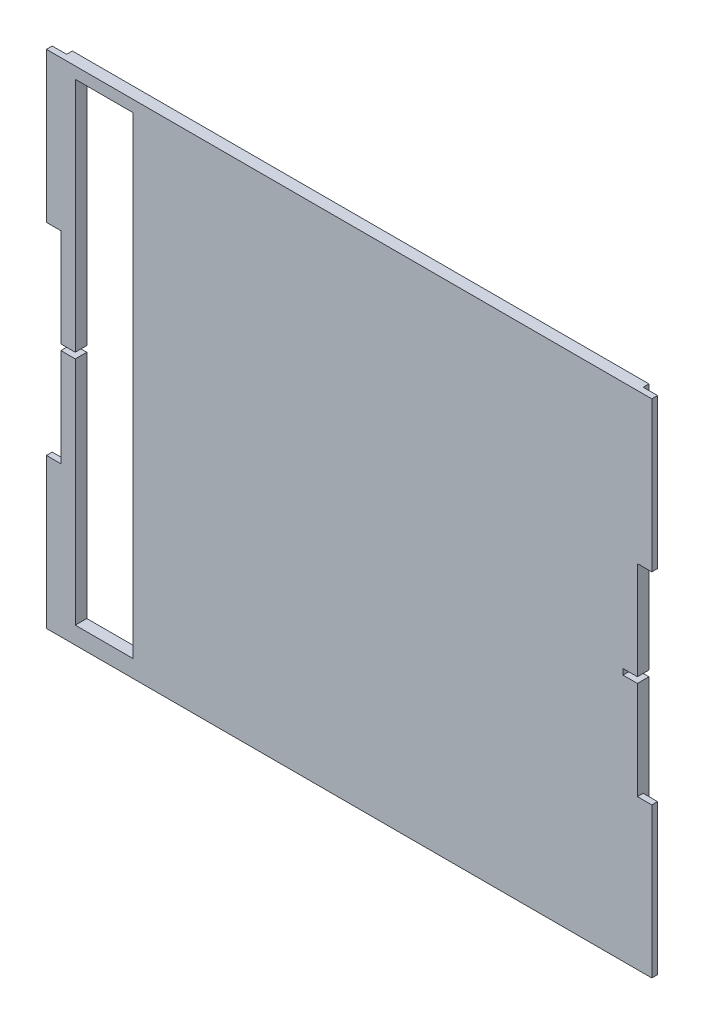
ISO-10303-21;
HEADER;
FILE_DESCRIPTION(('STEP AP214'),'2;1');
FILE_NAME('part.step','',(''),(''),'','','');
FILE_SCHEMA(('AUTOMOTIVE_DESIGN { 1 0 10303 214 1 1 1 1 }'));
ENDSEC;
DATA;
#1=APPLICATION_CONTEXT('core data for automotive mechanical design processes');
#2=APPLICATION_PROTOCOL_DEFINITION('international standard','automotive_design',2000,#1);
#3=PRODUCT_CONTEXT('',#1,'mechanical');
#4=PRODUCT('Part','Part','',(#3));
#5=PRODUCT_RELATED_PRODUCT_CATEGORY('part','',(#4));
#6=PRODUCT_DEFINITION_FORMATION('','',#4);
#7=PRODUCT_DEFINITION_CONTEXT('part definition',#1,'design');
#8=PRODUCT_DEFINITION('design','',#6,#7);
#9=PRODUCT_DEFINITION_SHAPE('','',#8);
#10=(LENGTH_UNIT() NAMED_UNIT(*) SI_UNIT(.MILLI.,.METRE.));
#11=(NAMED_UNIT(*) PLANE_ANGLE_UNIT() SI_UNIT($,.RADIAN.));
#12=(NAMED_UNIT(*) SI_UNIT($,.STERADIAN.) SOLID_ANGLE_UNIT());
#13=UNCERTAINTY_MEASURE_WITH_UNIT(LENGTH_MEASURE(1.E-05),#10,'distance_accuracy_value','');
#14=(GEOMETRIC_REPRESENTATION_CONTEXT(3) GLOBAL_UNCERTAINTY_ASSIGNED_CONTEXT((#13)) GLOBAL_UNIT_ASSIGNED_CONTEXT((#10,
#11,#12)) REPRESENTATION_CONTEXT('',''));
#15=CARTESIAN_POINT('',(0.,0.,0.));
#16=DIRECTION('',(0.,0.,1.));
#17=DIRECTION('',(1.,0.,0.));
#18=AXIS2_PLACEMENT_3D('',#15,#16,#17);
#19=CARTESIAN_POINT('',(0.,0.,2.));
#20=DIRECTION('',(0.,0.,1.));
#21=DIRECTION('',(1.,0.,0.));
#22=AXIS2_PLACEMENT_3D('',#19,#20,#21);
#23=PLANE('',#22);
#24=DIRECTION('',(0.,-1.,0.));
#25=VECTOR('',#24,1.);
#26=CARTESIAN_POINT('',(-100.5,35.,2.));
#27=LINE('',#26,#25);
#28=CARTESIAN_POINT('',(-100.5,35.,2.));
#29=VERTEX_POINT('',#28);
#30=CARTESIAN_POINT('',(-100.5,1.,2.));
#31=VERTEX_POINT('',#30);
#32=EDGE_CURVE('E235',#29,#31,#27,.T.);
#33=ORIENTED_EDGE('',*,*,#32,.T.);
#34=DIRECTION('',(1.,0.,0.));
#35=VECTOR('',#34,1.);
#36=CARTESIAN_POINT('',(-100.5,1.,2.));
#37=LINE('',#36,#35);
#38=CARTESIAN_POINT('',(-95.5,1.00000000000004,2.));
#39=VERTEX_POINT('',#38);
#40=EDGE_CURVE('E219',#31,#39,#37,.T.);
#41=ORIENTED_EDGE('',*,*,#40,.T.);
#42=DIRECTION('',(0.,-1.,0.));
#43=VECTOR('',#42,1.);
#44=CARTESIAN_POINT('',(-95.5,-81.,2.));
#45=LINE('',#44,#43);
#46=CARTESIAN_POINT('',(-95.5,83.,2.));
#47=VERTEX_POINT('',#46);
#48=EDGE_CURVE('E444',#47,#39,#45,.T.);
#49=ORIENTED_EDGE('',*,*,#48,.F.);
#50=DIRECTION('',(-1.,0.,0.));
#51=VECTOR('',#50,1.);
#52=CARTESIAN_POINT('',(-95.5,83.,2.));
#53=LINE('',#52,#51);
#54=CARTESIAN_POINT('',(-75.5,83.,2.));
#55=VERTEX_POINT('',#54);
#56=EDGE_CURVE('E450',#55,#47,#53,.T.);
#57=ORIENTED_EDGE('',*,*,#56,.F.);
#58=DIRECTION('',(0.,1.,0.));
#59=VECTOR('',#58,1.);
#60=CARTESIAN_POINT('',(-75.5,83.,2.));
#61=LINE('',#60,#59);
#62=CARTESIAN_POINT('',(-75.5,-81.,2.));
#63=VERTEX_POINT('',#62);
#64=EDGE_CURVE('E448',#63,#55,#61,.T.);
#65=ORIENTED_EDGE('',*,*,#64,.F.);
#66=DIRECTION('',(1.,0.,0.));
#67=VECTOR('',#66,1.);
#68=CARTESIAN_POINT('',(-75.5,-81.,2.));
#69=LINE('',#68,#67);
#70=CARTESIAN_POINT('',(-95.5,-81.,2.));
#71=VERTEX_POINT('',#70);
#72=EDGE_CURVE('E446',#71,#63,#69,.T.);
#73=ORIENTED_EDGE('',*,*,#72,.F.);
#74=CARTESIAN_POINT('',(-95.5,-0.999999999999957,2.));
#75=VERTEX_POINT('',#74);
#76=EDGE_CURVE('E393',#75,#71,#45,.T.);
#77=ORIENTED_EDGE('',*,*,#76,.F.);
#78=DIRECTION('',(-1.,0.,0.));
#79=VECTOR('',#78,1.);
#80=CARTESIAN_POINT('',(-95.5,-0.999999999999957,2.));
#81=LINE('',#80,#79);
#82=CARTESIAN_POINT('',(-100.5,-0.999999999999958,2.));
#83=VERTEX_POINT('',#82);
#84=EDGE_CURVE('E227',#75,#83,#81,.T.);
#85=ORIENTED_EDGE('',*,*,#84,.T.);
#86=CARTESIAN_POINT('',(-100.5,-35.,2.));
#87=VERTEX_POINT('',#86);
#88=EDGE_CURVE('E244',#83,#87,#27,.T.);
#89=ORIENTED_EDGE('',*,*,#88,.T.);
#90=DIRECTION('',(-1.,0.,0.));
#91=VECTOR('',#90,1.);
#92=CARTESIAN_POINT('',(-100.5,-35.,2.));
#93=LINE('',#92,#91);
#94=CARTESIAN_POINT('',(-105.5,-35.,2.));
#95=VERTEX_POINT('',#94);
#96=EDGE_CURVE('E279',#87,#95,#93,.T.);
#97=ORIENTED_EDGE('',*,*,#96,.T.);
#98=DIRECTION('',(0.,-1.,0.));
#99=VECTOR('',#98,1.);
#100=CARTESIAN_POINT('',(-105.5,-35.,2.));
#101=LINE('',#100,#99);
#102=CARTESIAN_POINT('',(-105.5,-87.,2.));
#103=VERTEX_POINT('',#102);
#104=EDGE_CURVE('E401',#95,#103,#101,.T.);
#105=ORIENTED_EDGE('',*,*,#104,.T.);
#106=DIRECTION('',(1.,0.,0.));
#107=VECTOR('',#106,1.);
#108=CARTESIAN_POINT('',(104.5,-87.,2.));
#109=LINE('',#108,#107);
#110=CARTESIAN_POINT('',(104.5,-87.,2.));
#111=VERTEX_POINT('',#110);
#112=EDGE_CURVE('E403',#103,#111,#109,.T.);
#113=ORIENTED_EDGE('',*,*,#112,.T.);
#114=DIRECTION('',(0.,1.,0.));
#115=VECTOR('',#114,1.);
#116=CARTESIAN_POINT('',(104.5,-35.,2.));
#117=LINE('',#116,#115);
#118=CARTESIAN_POINT('',(104.5,-35.,2.));
#119=VERTEX_POINT('',#118);
#120=EDGE_CURVE('E409',#111,#119,#117,.T.);
#121=ORIENTED_EDGE('',*,*,#120,.T.);
#122=DIRECTION('',(-1.,0.,0.));
#123=VECTOR('',#122,1.);
#124=CARTESIAN_POINT('',(99.5,-35.,2.));
#125=LINE('',#124,#123);
#126=CARTESIAN_POINT('',(99.5,-35.,2.));
#127=VERTEX_POINT('',#126);
#128=EDGE_CURVE('E411',#119,#127,#125,.T.);
#129=ORIENTED_EDGE('',*,*,#128,.T.);
#130=DIRECTION('',(0.,1.,0.));
#131=VECTOR('',#130,1.);
#132=CARTESIAN_POINT('',(99.5,35.,2.));
#133=LINE('',#132,#131);
#134=CARTESIAN_POINT('',(99.5,-1.,2.));
#135=VERTEX_POINT('',#134);
#136=EDGE_CURVE('E414',#127,#135,#133,.T.);
#137=ORIENTED_EDGE('',*,*,#136,.T.);
#138=DIRECTION('',(1.,0.,0.));
#139=VECTOR('',#138,1.);
#140=CARTESIAN_POINT('',(94.5,-1.,2.));
#141=LINE('',#140,#139);
#142=CARTESIAN_POINT('',(94.5,-1.,2.));
#143=VERTEX_POINT('',#142);
#144=EDGE_CURVE('E359',#143,#135,#141,.T.);
#145=ORIENTED_EDGE('',*,*,#144,.F.);
#146=DIRECTION('',(0.,-1.,0.));
#147=VECTOR('',#146,1.);
#148=CARTESIAN_POINT('',(94.5,0.999999999999999,2.));
#149=LINE('',#148,#147);
#150=CARTESIAN_POINT('',(94.5,0.999999999999999,2.));
#151=VERTEX_POINT('',#150);
#152=EDGE_CURVE('E356',#151,#143,#149,.T.);
#153=ORIENTED_EDGE('',*,*,#152,.F.);
#154=DIRECTION('',(-1.,0.,0.));
#155=VECTOR('',#154,1.);
#156=CARTESIAN_POINT('',(99.5,1.,2.));
#157=LINE('',#156,#155);
#158=CARTESIAN_POINT('',(99.5,1.,2.));
#159=VERTEX_POINT('',#158);
#160=EDGE_CURVE('E228',#159,#151,#157,.T.);
#161=ORIENTED_EDGE('',*,*,#160,.F.);
#162=CARTESIAN_POINT('',(99.5,35.,2.));
#163=VERTEX_POINT('',#162);
#164=EDGE_CURVE('E413',#159,#163,#133,.T.);
#165=ORIENTED_EDGE('',*,*,#164,.T.);
#166=DIRECTION('',(1.,0.,0.));
#167=VECTOR('',#166,1.);
#168=CARTESIAN_POINT('',(104.5,35.,2.));
#169=LINE('',#168,#167);
#170=CARTESIAN_POINT('',(104.5,35.,2.));
#171=VERTEX_POINT('',#170);
#172=EDGE_CURVE('E417',#163,#171,#169,.T.);
#173=ORIENTED_EDGE('',*,*,#172,.T.);
#174=DIRECTION('',(0.,1.,0.));
#175=VECTOR('',#174,1.);
#176=CARTESIAN_POINT('',(104.5,35.,2.));
#177=LINE('',#176,#175);
#178=CARTESIAN_POINT('',(104.5,87.0000000000001,2.));
#179=VERTEX_POINT('',#178);
#180=EDGE_CURVE('E419',#171,#179,#177,.T.);
#181=ORIENTED_EDGE('',*,*,#180,.T.);
#182=DIRECTION('',(-1.,0.,0.));
#183=VECTOR('',#182,1.);
#184=CARTESIAN_POINT('',(104.5,87.0000000000001,2.));
#185=LINE('',#184,#183);
#186=CARTESIAN_POINT('',(-105.5,87.,2.));
#187=VERTEX_POINT('',#186);
#188=EDGE_CURVE('E421',#179,#187,#185,.T.);
#189=ORIENTED_EDGE('',*,*,#188,.T.);
#190=DIRECTION('',(0.,-1.,0.));
#191=VECTOR('',#190,1.);
#192=CARTESIAN_POINT('',(-105.5,35.,2.));
#193=LINE('',#192,#191);
#194=CARTESIAN_POINT('',(-105.5,35.,2.));
#195=VERTEX_POINT('',#194);
#196=EDGE_CURVE('E422',#187,#195,#193,.T.);
#197=ORIENTED_EDGE('',*,*,#196,.T.);
#198=DIRECTION('',(1.,0.,0.));
#199=VECTOR('',#198,1.);
#200=CARTESIAN_POINT('',(-105.5,35.,2.));
#201=LINE('',#200,#199);
#202=EDGE_CURVE('E241',#195,#29,#201,.T.);
#203=ORIENTED_EDGE('',*,*,#202,.T.);
#204=EDGE_LOOP('',(#33,#41,#49,#57,#65,#73,#77,#85,#89,#97,#105,#113,#121,#129,#137,#145,#153,
#161,#165,#173,#181,#189,#197,#203));
#205=FACE_BOUND('',#204,.T.);
#206=ADVANCED_FACE('F33',(#205),#23,.T.);
#207=CARTESIAN_POINT('',(99.5,35.,2.));
#208=DIRECTION('',(-1.,0.,0.));
#209=DIRECTION('',(0.,0.,1.));
#210=AXIS2_PLACEMENT_3D('',#207,#208,#209);
#211=PLANE('',#210);
#212=DIRECTION('',(0.,1.,0.));
#213=VECTOR('',#212,1.);
#214=CARTESIAN_POINT('',(99.5,87.0000000000001,-2.));
#215=LINE('',#214,#213);
#216=CARTESIAN_POINT('',(99.5,-87.0000000000001,-2.));
#217=VERTEX_POINT('',#216);
#218=CARTESIAN_POINT('',(99.5,-1.,-2.));
#219=VERTEX_POINT('',#218);
#220=EDGE_CURVE('E343',#217,#219,#215,.T.);
#221=ORIENTED_EDGE('',*,*,#220,.T.);
#222=DIRECTION('',(0.,0.,1.));
#223=VECTOR('',#222,1.);
#224=CARTESIAN_POINT('',(99.5,-1.,-2.));
#225=LINE('',#224,#223);
#226=EDGE_CURVE('E369',#219,#135,#225,.T.);
#227=ORIENTED_EDGE('',*,*,#226,.T.);
#228=ORIENTED_EDGE('',*,*,#136,.F.);
#229=DIRECTION('',(0.,0.,-1.));
#230=VECTOR('',#229,1.);
#231=CARTESIAN_POINT('',(99.5,-35.,2.));
#232=LINE('',#231,#230);
#233=CARTESIAN_POINT('',(99.5,-35.,0.));
#234=VERTEX_POINT('',#233);
#235=EDGE_CURVE('E297',#127,#234,#232,.T.);
#236=ORIENTED_EDGE('',*,*,#235,.T.);
#237=DIRECTION('',(0.,1.,0.));
#238=VECTOR('',#237,1.);
#239=CARTESIAN_POINT('',(99.5,87.0000000000001,0.));
#240=LINE('',#239,#238);
#241=CARTESIAN_POINT('',(99.5,-87.0000000000001,0.));
#242=VERTEX_POINT('',#241);
#243=EDGE_CURVE('E44',#242,#234,#240,.T.);
#244=ORIENTED_EDGE('',*,*,#243,.F.);
#245=DIRECTION('',(0.,0.,1.));
#246=VECTOR('',#245,1.);
#247=CARTESIAN_POINT('',(99.5,-87.0000000000001,-2.));
#248=LINE('',#247,#246);
#249=EDGE_CURVE('E338',#217,#242,#248,.T.);
#250=ORIENTED_EDGE('',*,*,#249,.F.);
#251=EDGE_LOOP('',(#221,#227,#228,#236,#244,#250));
#252=FACE_BOUND('',#251,.T.);
#253=ADVANCED_FACE('F484',(#252),#211,.F.);
#254=CARTESIAN_POINT('',(-100.5,35.,2.));
#255=DIRECTION('',(1.,0.,0.));
#256=DIRECTION('',(0.,0.,-1.));
#257=AXIS2_PLACEMENT_3D('',#254,#255,#256);
#258=PLANE('',#257);
#259=DIRECTION('',(0.,0.,1.));
#260=VECTOR('',#259,1.);
#261=CARTESIAN_POINT('',(-100.5,1.,-2.));
#262=LINE('',#261,#260);
#263=CARTESIAN_POINT('',(-100.5,1.00000000000001,-2.));
#264=VERTEX_POINT('',#263);
#265=EDGE_CURVE('E59',#264,#31,#262,.T.);
#266=ORIENTED_EDGE('',*,*,#265,.T.);
#267=ORIENTED_EDGE('',*,*,#32,.F.);
#268=DIRECTION('',(0.,0.,-1.));
#269=VECTOR('',#268,1.);
#270=CARTESIAN_POINT('',(-100.5,35.,2.));
#271=LINE('',#270,#269);
#272=CARTESIAN_POINT('',(-100.5,35.,0.));
#273=VERTEX_POINT('',#272);
#274=EDGE_CURVE('E247',#29,#273,#271,.T.);
#275=ORIENTED_EDGE('',*,*,#274,.T.);
#276=DIRECTION('',(0.,-1.,0.));
#277=VECTOR('',#276,1.);
#278=CARTESIAN_POINT('',(-100.5,87.0000000000001,0.));
#279=LINE('',#278,#277);
#280=CARTESIAN_POINT('',(-100.5,87.0000000000001,0.));
#281=VERTEX_POINT('',#280);
#282=EDGE_CURVE('E316',#281,#273,#279,.T.);
#283=ORIENTED_EDGE('',*,*,#282,.F.);
#284=DIRECTION('',(0.,0.,1.));
#285=VECTOR('',#284,1.);
#286=CARTESIAN_POINT('',(-100.5,87.0000000000001,-2.));
#287=LINE('',#286,#285);
#288=CARTESIAN_POINT('',(-100.5,87.0000000000001,-2.));
#289=VERTEX_POINT('',#288);
#290=EDGE_CURVE('E432',#289,#281,#287,.T.);
#291=ORIENTED_EDGE('',*,*,#290,.F.);
#292=DIRECTION('',(0.,-1.,0.));
#293=VECTOR('',#292,1.);
#294=CARTESIAN_POINT('',(-100.5,87.0000000000001,-2.));
#295=LINE('',#294,#293);
#296=EDGE_CURVE('E237',#289,#264,#295,.T.);
#297=ORIENTED_EDGE('',*,*,#296,.T.);
#298=EDGE_LOOP('',(#266,#267,#275,#283,#291,#297));
#299=FACE_BOUND('',#298,.T.);
#300=ADVANCED_FACE('F233',(#299),#258,.F.);
#301=DIRECTION('',(0.,0.,1.));
#302=VECTOR('',#301,1.);
#303=CARTESIAN_POINT('',(-100.5,-0.999999999999958,-2.));
#304=LINE('',#303,#302);
#305=CARTESIAN_POINT('',(-100.5,-0.999999999999958,-2.));
#306=VERTEX_POINT('',#305);
#307=EDGE_CURVE('E381',#306,#83,#304,.T.);
#308=ORIENTED_EDGE('',*,*,#307,.F.);
#309=CARTESIAN_POINT('',(-100.5,-87.0000000000001,-2.));
#310=VERTEX_POINT('',#309);
#311=EDGE_CURVE('E339',#306,#310,#295,.T.);
#312=ORIENTED_EDGE('',*,*,#311,.T.);
#313=DIRECTION('',(0.,0.,1.));
#314=VECTOR('',#313,1.);
#315=CARTESIAN_POINT('',(-100.5,-87.0000000000001,-2.));
#316=LINE('',#315,#314);
#317=CARTESIAN_POINT('',(-100.5,-87.,0.));
#318=VERTEX_POINT('',#317);
#319=EDGE_CURVE('E438',#310,#318,#316,.T.);
#320=ORIENTED_EDGE('',*,*,#319,.T.);
#321=CARTESIAN_POINT('',(-100.5,-35.,0.));
#322=VERTEX_POINT('',#321);
#323=EDGE_CURVE('E42',#322,#318,#279,.T.);
#324=ORIENTED_EDGE('',*,*,#323,.F.);
#325=DIRECTION('',(0.,0.,-1.));
#326=VECTOR('',#325,1.);
#327=CARTESIAN_POINT('',(-100.5,-35.,2.));
#328=LINE('',#327,#326);
#329=EDGE_CURVE('E243',#87,#322,#328,.T.);
#330=ORIENTED_EDGE('',*,*,#329,.F.);
#331=ORIENTED_EDGE('',*,*,#88,.F.);
#332=EDGE_LOOP('',(#308,#312,#320,#324,#330,#331));
#333=FACE_BOUND('',#332,.T.);
#334=ADVANCED_FACE('F397',(#333),#258,.F.);
#335=CARTESIAN_POINT('',(-95.5,35.,2.));
#336=DIRECTION('',(1.,0.,0.));
#337=DIRECTION('',(0.,0.,-1.));
#338=AXIS2_PLACEMENT_3D('',#335,#336,#337);
#339=PLANE('',#338);
#340=ORIENTED_EDGE('',*,*,#48,.T.);
#341=DIRECTION('',(0.,0.,1.));
#342=VECTOR('',#341,1.);
#343=CARTESIAN_POINT('',(-95.5,1.00000000000004,-2.));
#344=LINE('',#343,#342);
#345=CARTESIAN_POINT('',(-95.5,1.00000000000004,-2.));
#346=VERTEX_POINT('',#345);
#347=EDGE_CURVE('E222',#346,#39,#344,.T.);
#348=ORIENTED_EDGE('',*,*,#347,.F.);
#349=DIRECTION('',(0.,-1.,0.));
#350=VECTOR('',#349,1.);
#351=CARTESIAN_POINT('',(-95.5,83.,-2.));
#352=LINE('',#351,#350);
#353=CARTESIAN_POINT('',(-95.5,83.,-2.));
#354=VERTEX_POINT('',#353);
#355=EDGE_CURVE('E351',#354,#346,#352,.T.);
#356=ORIENTED_EDGE('',*,*,#355,.F.);
#357=DIRECTION('',(0.,0.,-1.));
#358=VECTOR('',#357,1.);
#359=CARTESIAN_POINT('',(-95.5,83.,2.));
#360=LINE('',#359,#358);
#361=EDGE_CURVE('E453',#47,#354,#360,.T.);
#362=ORIENTED_EDGE('',*,*,#361,.F.);
#363=EDGE_LOOP('',(#340,#348,#356,#362));
#364=FACE_BOUND('',#363,.T.);
#365=ADVANCED_FACE('F572',(#364),#339,.T.);
#366=CARTESIAN_POINT('',(-95.5,-0.999999999999959,-2.));
#367=VERTEX_POINT('',#366);
#368=CARTESIAN_POINT('',(-95.5,-81.,-2.));
#369=VERTEX_POINT('',#368);
#370=EDGE_CURVE('E238',#367,#369,#352,.T.);
#371=ORIENTED_EDGE('',*,*,#370,.F.);
#372=DIRECTION('',(0.,0.,1.));
#373=VECTOR('',#372,1.);
#374=CARTESIAN_POINT('',(-95.5,-0.999999999999957,-2.));
#375=LINE('',#374,#373);
#376=EDGE_CURVE('E378',#367,#75,#375,.T.);
#377=ORIENTED_EDGE('',*,*,#376,.T.);
#378=ORIENTED_EDGE('',*,*,#76,.T.);
#379=DIRECTION('',(0.,0.,-1.));
#380=VECTOR('',#379,1.);
#381=CARTESIAN_POINT('',(-95.5,-81.,2.));
#382=LINE('',#381,#380);
#383=EDGE_CURVE('E256',#71,#369,#382,.T.);
#384=ORIENTED_EDGE('',*,*,#383,.T.);
#385=EDGE_LOOP('',(#371,#377,#378,#384));
#386=FACE_BOUND('',#385,.T.);
#387=ADVANCED_FACE('F465',(#386),#339,.T.);
#388=CARTESIAN_POINT('',(0.,0.,-2.));
#389=DIRECTION('',(0.,0.,1.));
#390=DIRECTION('',(1.,0.,0.));
#391=AXIS2_PLACEMENT_3D('',#388,#389,#390);
#392=PLANE('',#391);
#393=DIRECTION('',(1.,0.,0.));
#394=VECTOR('',#393,1.);
#395=CARTESIAN_POINT('',(-100.5,1.,-2.));
#396=LINE('',#395,#394);
#397=EDGE_CURVE('E385',#264,#346,#396,.T.);
#398=ORIENTED_EDGE('',*,*,#397,.F.);
#399=ORIENTED_EDGE('',*,*,#296,.F.);
#400=DIRECTION('',(-1.,0.,0.));
#401=VECTOR('',#400,1.);
#402=CARTESIAN_POINT('',(99.5,87.0000000000001,-2.));
#403=LINE('',#402,#401);
#404=CARTESIAN_POINT('',(99.5,87.0000000000001,-2.));
#405=VERTEX_POINT('',#404);
#406=EDGE_CURVE('E340',#405,#289,#403,.T.);
#407=ORIENTED_EDGE('',*,*,#406,.F.);
#408=CARTESIAN_POINT('',(99.5,1.,-2.));
#409=VERTEX_POINT('',#408);
#410=EDGE_CURVE('E326',#409,#405,#215,.T.);
#411=ORIENTED_EDGE('',*,*,#410,.F.);
#412=DIRECTION('',(-1.,0.,0.));
#413=VECTOR('',#412,1.);
#414=CARTESIAN_POINT('',(99.5,1.,-2.));
#415=LINE('',#414,#413);
#416=CARTESIAN_POINT('',(94.5,0.999999999999999,-2.));
#417=VERTEX_POINT('',#416);
#418=EDGE_CURVE('E361',#409,#417,#415,.T.);
#419=ORIENTED_EDGE('',*,*,#418,.T.);
#420=DIRECTION('',(0.,-1.,0.));
#421=VECTOR('',#420,1.);
#422=CARTESIAN_POINT('',(94.5,0.999999999999999,-2.));
#423=LINE('',#422,#421);
#424=CARTESIAN_POINT('',(94.5,-1.,-2.));
#425=VERTEX_POINT('',#424);
#426=EDGE_CURVE('E51',#417,#425,#423,.T.);
#427=ORIENTED_EDGE('',*,*,#426,.T.);
#428=DIRECTION('',(1.,0.,0.));
#429=VECTOR('',#428,1.);
#430=CARTESIAN_POINT('',(94.5,-1.,-2.));
#431=LINE('',#430,#429);
#432=EDGE_CURVE('E365',#425,#219,#431,.T.);
#433=ORIENTED_EDGE('',*,*,#432,.T.);
#434=ORIENTED_EDGE('',*,*,#220,.F.);
#435=DIRECTION('',(1.,0.,0.));
#436=VECTOR('',#435,1.);
#437=CARTESIAN_POINT('',(99.5,-87.0000000000001,-2.));
#438=LINE('',#437,#436);
#439=EDGE_CURVE('E320',#310,#217,#438,.T.);
#440=ORIENTED_EDGE('',*,*,#439,.F.);
#441=ORIENTED_EDGE('',*,*,#311,.F.);
#442=DIRECTION('',(-1.,0.,0.));
#443=VECTOR('',#442,1.);
#444=CARTESIAN_POINT('',(-95.5,-0.999999999999957,-2.));
#445=LINE('',#444,#443);
#446=EDGE_CURVE('E383',#367,#306,#445,.T.);
#447=ORIENTED_EDGE('',*,*,#446,.F.);
#448=ORIENTED_EDGE('',*,*,#370,.T.);
#449=DIRECTION('',(1.,0.,0.));
#450=VECTOR('',#449,1.);
#451=CARTESIAN_POINT('',(-95.5,-81.,-2.));
#452=LINE('',#451,#450);
#453=CARTESIAN_POINT('',(-75.5,-81.,-2.));
#454=VERTEX_POINT('',#453);
#455=EDGE_CURVE('E348',#369,#454,#452,.T.);
#456=ORIENTED_EDGE('',*,*,#455,.T.);
#457=DIRECTION('',(0.,1.,0.));
#458=VECTOR('',#457,1.);
#459=CARTESIAN_POINT('',(-75.5,83.,-2.));
#460=LINE('',#459,#458);
#461=CARTESIAN_POINT('',(-75.5,83.,-2.));
#462=VERTEX_POINT('',#461);
#463=EDGE_CURVE('E334',#454,#462,#460,.T.);
#464=ORIENTED_EDGE('',*,*,#463,.T.);
#465=DIRECTION('',(-1.,0.,0.));
#466=VECTOR('',#465,1.);
#467=CARTESIAN_POINT('',(-95.5,83.,-2.));
#468=LINE('',#467,#466);
#469=EDGE_CURVE('E328',#462,#354,#468,.T.);
#470=ORIENTED_EDGE('',*,*,#469,.T.);
#471=ORIENTED_EDGE('',*,*,#355,.T.);
#472=EDGE_LOOP('',(#398,#399,#407,#411,#419,#427,#433,#434,#440,#441,#447,#448,#456,#464,#470,#471));
#473=FACE_BOUND('',#472,.T.);
#474=ADVANCED_FACE('F468',(#473),#392,.F.);
#475=CARTESIAN_POINT('',(0.,0.,0.));
#476=DIRECTION('',(0.,0.,1.));
#477=DIRECTION('',(1.,0.,0.));
#478=AXIS2_PLACEMENT_3D('',#475,#476,#477);
#479=PLANE('',#478);
#480=DIRECTION('',(1.,0.,0.));
#481=VECTOR('',#480,1.);
#482=CARTESIAN_POINT('',(104.5,-87.,0.));
#483=LINE('',#482,#481);
#484=CARTESIAN_POINT('',(104.5,-87.,0.));
#485=VERTEX_POINT('',#484);
#486=EDGE_CURVE('E258',#242,#485,#483,.T.);
#487=ORIENTED_EDGE('',*,*,#486,.F.);
#488=ORIENTED_EDGE('',*,*,#243,.T.);
#489=DIRECTION('',(-1.,0.,0.));
#490=VECTOR('',#489,1.);
#491=CARTESIAN_POINT('',(99.5,-35.,0.));
#492=LINE('',#491,#490);
#493=CARTESIAN_POINT('',(104.5,-35.,0.));
#494=VERTEX_POINT('',#493);
#495=EDGE_CURVE('E264',#494,#234,#492,.T.);
#496=ORIENTED_EDGE('',*,*,#495,.F.);
#497=DIRECTION('',(0.,1.,0.));
#498=VECTOR('',#497,1.);
#499=CARTESIAN_POINT('',(104.5,-35.,0.));
#500=LINE('',#499,#498);
#501=EDGE_CURVE('E262',#485,#494,#500,.T.);
#502=ORIENTED_EDGE('',*,*,#501,.F.);
#503=EDGE_LOOP('',(#487,#488,#496,#502));
#504=FACE_BOUND('',#503,.T.);
#505=ADVANCED_FACE('F498',(#504),#479,.F.);
#506=DIRECTION('',(1.,0.,0.));
#507=VECTOR('',#506,1.);
#508=CARTESIAN_POINT('',(104.5,35.,0.));
#509=LINE('',#508,#507);
#510=CARTESIAN_POINT('',(99.5,35.,0.));
#511=VERTEX_POINT('',#510);
#512=CARTESIAN_POINT('',(104.5,35.,0.));
#513=VERTEX_POINT('',#512);
#514=EDGE_CURVE('E267',#511,#513,#509,.T.);
#515=ORIENTED_EDGE('',*,*,#514,.F.);
#516=CARTESIAN_POINT('',(99.5,87.0000000000001,0.));
#517=VERTEX_POINT('',#516);
#518=EDGE_CURVE('E11',#511,#517,#240,.T.);
#519=ORIENTED_EDGE('',*,*,#518,.T.);
#520=DIRECTION('',(-1.,0.,0.));
#521=VECTOR('',#520,1.);
#522=CARTESIAN_POINT('',(104.5,87.0000000000001,0.));
#523=LINE('',#522,#521);
#524=CARTESIAN_POINT('',(104.5,87.0000000000001,0.));
#525=VERTEX_POINT('',#524);
#526=EDGE_CURVE('E272',#525,#517,#523,.T.);
#527=ORIENTED_EDGE('',*,*,#526,.F.);
#528=DIRECTION('',(0.,1.,0.));
#529=VECTOR('',#528,1.);
#530=CARTESIAN_POINT('',(104.5,35.,0.));
#531=LINE('',#530,#529);
#532=EDGE_CURVE('E269',#513,#525,#531,.T.);
#533=ORIENTED_EDGE('',*,*,#532,.F.);
#534=EDGE_LOOP('',(#515,#519,#527,#533));
#535=FACE_BOUND('',#534,.T.);
#536=ADVANCED_FACE('F559',(#535),#479,.F.);
#537=CARTESIAN_POINT('',(-105.5,87.,0.));
#538=VERTEX_POINT('',#537);
#539=EDGE_CURVE('E271',#281,#538,#523,.T.);
#540=ORIENTED_EDGE('',*,*,#539,.F.);
#541=ORIENTED_EDGE('',*,*,#282,.T.);
#542=DIRECTION('',(1.,0.,0.));
#543=VECTOR('',#542,1.);
#544=CARTESIAN_POINT('',(-105.5,35.,0.));
#545=LINE('',#544,#543);
#546=CARTESIAN_POINT('',(-105.5,35.,0.));
#547=VERTEX_POINT('',#546);
#548=EDGE_CURVE('E277',#547,#273,#545,.T.);
#549=ORIENTED_EDGE('',*,*,#548,.F.);
#550=DIRECTION('',(0.,-1.,0.));
#551=VECTOR('',#550,1.);
#552=CARTESIAN_POINT('',(-105.5,35.,0.));
#553=LINE('',#552,#551);
#554=EDGE_CURVE('E275',#538,#547,#553,.T.);
#555=ORIENTED_EDGE('',*,*,#554,.F.);
#556=EDGE_LOOP('',(#540,#541,#549,#555));
#557=FACE_BOUND('',#556,.T.);
#558=ADVANCED_FACE('F433',(#557),#479,.F.);
#559=DIRECTION('',(-1.,0.,0.));
#560=VECTOR('',#559,1.);
#561=CARTESIAN_POINT('',(-100.5,-35.,0.));
#562=LINE('',#561,#560);
#563=CARTESIAN_POINT('',(-105.5,-35.,0.));
#564=VERTEX_POINT('',#563);
#565=EDGE_CURVE('E252',#322,#564,#562,.T.);
#566=ORIENTED_EDGE('',*,*,#565,.F.);
#567=ORIENTED_EDGE('',*,*,#323,.T.);
#568=CARTESIAN_POINT('',(-105.5,-87.,0.));
#569=VERTEX_POINT('',#568);
#570=EDGE_CURVE('E259',#569,#318,#483,.T.);
#571=ORIENTED_EDGE('',*,*,#570,.F.);
#572=DIRECTION('',(0.,-1.,0.));
#573=VECTOR('',#572,1.);
#574=CARTESIAN_POINT('',(-105.5,-35.,0.));
#575=LINE('',#574,#573);
#576=EDGE_CURVE('E255',#564,#569,#575,.T.);
#577=ORIENTED_EDGE('',*,*,#576,.F.);
#578=EDGE_LOOP('',(#566,#567,#571,#577));
#579=FACE_BOUND('',#578,.T.);
#580=ADVANCED_FACE('F495',(#579),#479,.F.);
#581=CARTESIAN_POINT('',(-100.5,-35.,2.));
#582=DIRECTION('',(0.,-1.,0.));
#583=DIRECTION('',(0.,0.,-1.));
#584=AXIS2_PLACEMENT_3D('',#581,#582,#583);
#585=PLANE('',#584);
#586=ORIENTED_EDGE('',*,*,#565,.T.);
#587=DIRECTION('',(0.,0.,-1.));
#588=VECTOR('',#587,1.);
#589=CARTESIAN_POINT('',(-105.5,-35.,2.));
#590=LINE('',#589,#588);
#591=EDGE_CURVE('E37',#95,#564,#590,.T.);
#592=ORIENTED_EDGE('',*,*,#591,.F.);
#593=ORIENTED_EDGE('',*,*,#96,.F.);
#594=ORIENTED_EDGE('',*,*,#329,.T.);
#595=EDGE_LOOP('',(#586,#592,#593,#594));
#596=FACE_BOUND('',#595,.T.);
#597=ADVANCED_FACE('F35',(#596),#585,.F.);
#598=CARTESIAN_POINT('',(-105.5,-35.,2.));
#599=DIRECTION('',(1.,0.,0.));
#600=DIRECTION('',(0.,0.,-1.));
#601=AXIS2_PLACEMENT_3D('',#598,#599,#600);
#602=PLANE('',#601);
#603=ORIENTED_EDGE('',*,*,#576,.T.);
#604=DIRECTION('',(0.,0.,-1.));
#605=VECTOR('',#604,1.);
#606=CARTESIAN_POINT('',(-105.5,-87.,2.));
#607=LINE('',#606,#605);
#608=EDGE_CURVE('E305',#103,#569,#607,.T.);
#609=ORIENTED_EDGE('',*,*,#608,.F.);
#610=ORIENTED_EDGE('',*,*,#104,.F.);
#611=ORIENTED_EDGE('',*,*,#591,.T.);
#612=EDGE_LOOP('',(#603,#609,#610,#611));
#613=FACE_BOUND('',#612,.T.);
#614=ADVANCED_FACE('F527',(#613),#602,.F.);
#615=CARTESIAN_POINT('',(104.5,-87.,2.));
#616=DIRECTION('',(0.,1.,0.));
#617=DIRECTION('',(0.,0.,1.));
#618=AXIS2_PLACEMENT_3D('',#615,#616,#617);
#619=PLANE('',#618);
#620=ORIENTED_EDGE('',*,*,#570,.T.);
#621=ORIENTED_EDGE('',*,*,#319,.F.);
#622=ORIENTED_EDGE('',*,*,#439,.T.);
#623=ORIENTED_EDGE('',*,*,#249,.T.);
#624=ORIENTED_EDGE('',*,*,#486,.T.);
#625=DIRECTION('',(0.,0.,-1.));
#626=VECTOR('',#625,1.);
#627=CARTESIAN_POINT('',(104.5,-87.,2.));
#628=LINE('',#627,#626);
#629=EDGE_CURVE('E303',#111,#485,#628,.T.);
#630=ORIENTED_EDGE('',*,*,#629,.F.);
#631=ORIENTED_EDGE('',*,*,#112,.F.);
#632=ORIENTED_EDGE('',*,*,#608,.T.);
#633=EDGE_LOOP('',(#620,#621,#622,#623,#624,#630,#631,#632));
#634=FACE_BOUND('',#633,.T.);
#635=ADVANCED_FACE('F524',(#634),#619,.F.);
#636=CARTESIAN_POINT('',(104.5,-35.,2.));
#637=DIRECTION('',(-1.,0.,0.));
#638=DIRECTION('',(0.,0.,1.));
#639=AXIS2_PLACEMENT_3D('',#636,#637,#638);
#640=PLANE('',#639);
#641=ORIENTED_EDGE('',*,*,#501,.T.);
#642=DIRECTION('',(0.,0.,-1.));
#643=VECTOR('',#642,1.);
#644=CARTESIAN_POINT('',(104.5,-35.,2.));
#645=LINE('',#644,#643);
#646=EDGE_CURVE('E300',#119,#494,#645,.T.);
#647=ORIENTED_EDGE('',*,*,#646,.F.);
#648=ORIENTED_EDGE('',*,*,#120,.F.);
#649=ORIENTED_EDGE('',*,*,#629,.T.);
#650=EDGE_LOOP('',(#641,#647,#648,#649));
#651=FACE_BOUND('',#650,.T.);
#652=ADVANCED_FACE('F520',(#651),#640,.F.);
#653=CARTESIAN_POINT('',(99.5,-35.,2.));
#654=DIRECTION('',(0.,-1.,0.));
#655=DIRECTION('',(0.,0.,-1.));
#656=AXIS2_PLACEMENT_3D('',#653,#654,#655);
#657=PLANE('',#656);
#658=ORIENTED_EDGE('',*,*,#495,.T.);
#659=ORIENTED_EDGE('',*,*,#235,.F.);
#660=ORIENTED_EDGE('',*,*,#128,.F.);
#661=ORIENTED_EDGE('',*,*,#646,.T.);
#662=EDGE_LOOP('',(#658,#659,#660,#661));
#663=FACE_BOUND('',#662,.T.);
#664=ADVANCED_FACE('F516',(#663),#657,.F.);
#665=ORIENTED_EDGE('',*,*,#164,.F.);
#666=DIRECTION('',(0.,0.,1.));
#667=VECTOR('',#666,1.);
#668=CARTESIAN_POINT('',(99.5,1.,-2.));
#669=LINE('',#668,#667);
#670=EDGE_CURVE('E368',#409,#159,#669,.T.);
#671=ORIENTED_EDGE('',*,*,#670,.F.);
#672=ORIENTED_EDGE('',*,*,#410,.T.);
#673=DIRECTION('',(0.,0.,1.));
#674=VECTOR('',#673,1.);
#675=CARTESIAN_POINT('',(99.5,87.0000000000001,-2.));
#676=LINE('',#675,#674);
#677=EDGE_CURVE('E439',#405,#517,#676,.T.);
#678=ORIENTED_EDGE('',*,*,#677,.T.);
#679=ORIENTED_EDGE('',*,*,#518,.F.);
#680=DIRECTION('',(0.,0.,-1.));
#681=VECTOR('',#680,1.);
#682=CARTESIAN_POINT('',(99.5,35.,2.));
#683=LINE('',#682,#681);
#684=EDGE_CURVE('E294',#163,#511,#683,.T.);
#685=ORIENTED_EDGE('',*,*,#684,.F.);
#686=EDGE_LOOP('',(#665,#671,#672,#678,#679,#685));
#687=FACE_BOUND('',#686,.T.);
#688=ADVANCED_FACE('F491',(#687),#211,.F.);
#689=CARTESIAN_POINT('',(104.5,35.,2.));
#690=DIRECTION('',(0.,1.,0.));
#691=DIRECTION('',(0.,0.,1.));
#692=AXIS2_PLACEMENT_3D('',#689,#690,#691);
#693=PLANE('',#692);
#694=ORIENTED_EDGE('',*,*,#514,.T.);
#695=DIRECTION('',(0.,0.,-1.));
#696=VECTOR('',#695,1.);
#697=CARTESIAN_POINT('',(104.5,35.,2.));
#698=LINE('',#697,#696);
#699=EDGE_CURVE('E291',#171,#513,#698,.T.);
#700=ORIENTED_EDGE('',*,*,#699,.F.);
#701=ORIENTED_EDGE('',*,*,#172,.F.);
#702=ORIENTED_EDGE('',*,*,#684,.T.);
#703=EDGE_LOOP('',(#694,#700,#701,#702));
#704=FACE_BOUND('',#703,.T.);
#705=ADVANCED_FACE('F510',(#704),#693,.F.);
#706=CARTESIAN_POINT('',(104.5,35.,2.));
#707=DIRECTION('',(-1.,0.,0.));
#708=DIRECTION('',(0.,0.,1.));
#709=AXIS2_PLACEMENT_3D('',#706,#707,#708);
#710=PLANE('',#709);
#711=ORIENTED_EDGE('',*,*,#532,.T.);
#712=DIRECTION('',(0.,0.,-1.));
#713=VECTOR('',#712,1.);
#714=CARTESIAN_POINT('',(104.5,87.0000000000001,2.));
#715=LINE('',#714,#713);
#716=EDGE_CURVE('E288',#179,#525,#715,.T.);
#717=ORIENTED_EDGE('',*,*,#716,.F.);
#718=ORIENTED_EDGE('',*,*,#180,.F.);
#719=ORIENTED_EDGE('',*,*,#699,.T.);
#720=EDGE_LOOP('',(#711,#717,#718,#719));
#721=FACE_BOUND('',#720,.T.);
#722=ADVANCED_FACE('F507',(#721),#710,.F.);
#723=CARTESIAN_POINT('',(104.5,87.0000000000001,2.));
#724=DIRECTION('',(0.,-1.,0.));
#725=DIRECTION('',(1.,0.,0.));
#726=AXIS2_PLACEMENT_3D('',#723,#724,#725);
#727=PLANE('',#726);
#728=ORIENTED_EDGE('',*,*,#526,.T.);
#729=ORIENTED_EDGE('',*,*,#677,.F.);
#730=ORIENTED_EDGE('',*,*,#406,.T.);
#731=ORIENTED_EDGE('',*,*,#290,.T.);
#732=ORIENTED_EDGE('',*,*,#539,.T.);
#733=DIRECTION('',(0.,0.,-1.));
#734=VECTOR('',#733,1.);
#735=CARTESIAN_POINT('',(-105.5,87.,2.));
#736=LINE('',#735,#734);
#737=EDGE_CURVE('E285',#187,#538,#736,.T.);
#738=ORIENTED_EDGE('',*,*,#737,.F.);
#739=ORIENTED_EDGE('',*,*,#188,.F.);
#740=ORIENTED_EDGE('',*,*,#716,.T.);
#741=EDGE_LOOP('',(#728,#729,#730,#731,#732,#738,#739,#740));
#742=FACE_BOUND('',#741,.T.);
#743=ADVANCED_FACE('F435',(#742),#727,.F.);
#744=CARTESIAN_POINT('',(-105.5,35.,2.));
#745=DIRECTION('',(1.,0.,0.));
#746=DIRECTION('',(0.,0.,-1.));
#747=AXIS2_PLACEMENT_3D('',#744,#745,#746);
#748=PLANE('',#747);
#749=ORIENTED_EDGE('',*,*,#554,.T.);
#750=DIRECTION('',(0.,0.,-1.));
#751=VECTOR('',#750,1.);
#752=CARTESIAN_POINT('',(-105.5,35.,2.));
#753=LINE('',#752,#751);
#754=EDGE_CURVE('E282',#195,#547,#753,.T.);
#755=ORIENTED_EDGE('',*,*,#754,.F.);
#756=ORIENTED_EDGE('',*,*,#196,.F.);
#757=ORIENTED_EDGE('',*,*,#737,.T.);
#758=EDGE_LOOP('',(#749,#755,#756,#757));
#759=FACE_BOUND('',#758,.T.);
#760=ADVANCED_FACE('F428',(#759),#748,.F.);
#761=CARTESIAN_POINT('',(-105.5,35.,2.));
#762=DIRECTION('',(0.,1.,0.));
#763=DIRECTION('',(0.,0.,1.));
#764=AXIS2_PLACEMENT_3D('',#761,#762,#763);
#765=PLANE('',#764);
#766=ORIENTED_EDGE('',*,*,#548,.T.);
#767=ORIENTED_EDGE('',*,*,#274,.F.);
#768=ORIENTED_EDGE('',*,*,#202,.F.);
#769=ORIENTED_EDGE('',*,*,#754,.T.);
#770=EDGE_LOOP('',(#766,#767,#768,#769));
#771=FACE_BOUND('',#770,.T.);
#772=ADVANCED_FACE('F431',(#771),#765,.F.);
#773=CARTESIAN_POINT('',(-75.5,-81.,2.));
#774=DIRECTION('',(0.,1.,0.));
#775=DIRECTION('',(0.,0.,1.));
#776=AXIS2_PLACEMENT_3D('',#773,#774,#775);
#777=PLANE('',#776);
#778=DIRECTION('',(0.,0.,-1.));
#779=VECTOR('',#778,1.);
#780=CARTESIAN_POINT('',(-75.5,-81.,2.));
#781=LINE('',#780,#779);
#782=EDGE_CURVE('E456',#63,#454,#781,.T.);
#783=ORIENTED_EDGE('',*,*,#782,.T.);
#784=ORIENTED_EDGE('',*,*,#455,.F.);
#785=ORIENTED_EDGE('',*,*,#383,.F.);
#786=ORIENTED_EDGE('',*,*,#72,.T.);
#787=EDGE_LOOP('',(#783,#784,#785,#786));
#788=FACE_BOUND('',#787,.T.);
#789=ADVANCED_FACE('F466',(#788),#777,.T.);
#790=CARTESIAN_POINT('',(-75.5,83.,2.));
#791=DIRECTION('',(-1.,0.,0.));
#792=DIRECTION('',(0.,-1.,0.));
#793=AXIS2_PLACEMENT_3D('',#790,#791,#792);
#794=PLANE('',#793);
#795=DIRECTION('',(0.,0.,-1.));
#796=VECTOR('',#795,1.);
#797=CARTESIAN_POINT('',(-75.5,83.,2.));
#798=LINE('',#797,#796);
#799=EDGE_CURVE('E455',#55,#462,#798,.T.);
#800=ORIENTED_EDGE('',*,*,#799,.T.);
#801=ORIENTED_EDGE('',*,*,#463,.F.);
#802=ORIENTED_EDGE('',*,*,#782,.F.);
#803=ORIENTED_EDGE('',*,*,#64,.T.);
#804=EDGE_LOOP('',(#800,#801,#802,#803));
#805=FACE_BOUND('',#804,.T.);
#806=ADVANCED_FACE('F581',(#805),#794,.T.);
#807=CARTESIAN_POINT('',(-95.5,83.,2.));
#808=DIRECTION('',(0.,-1.,0.));
#809=DIRECTION('',(0.,0.,-1.));
#810=AXIS2_PLACEMENT_3D('',#807,#808,#809);
#811=PLANE('',#810);
#812=ORIENTED_EDGE('',*,*,#361,.T.);
#813=ORIENTED_EDGE('',*,*,#469,.F.);
#814=ORIENTED_EDGE('',*,*,#799,.F.);
#815=ORIENTED_EDGE('',*,*,#56,.T.);
#816=EDGE_LOOP('',(#812,#813,#814,#815));
#817=FACE_BOUND('',#816,.T.);
#818=ADVANCED_FACE('F579',(#817),#811,.T.);
#819=CARTESIAN_POINT('',(94.5,-1.,-2.));
#820=DIRECTION('',(0.,-1.,0.));
#821=DIRECTION('',(1.,0.,0.));
#822=AXIS2_PLACEMENT_3D('',#819,#820,#821);
#823=PLANE('',#822);
#824=ORIENTED_EDGE('',*,*,#226,.F.);
#825=ORIENTED_EDGE('',*,*,#432,.F.);
#826=DIRECTION('',(0.,0.,1.));
#827=VECTOR('',#826,1.);
#828=CARTESIAN_POINT('',(94.5,-1.,-2.));
#829=LINE('',#828,#827);
#830=EDGE_CURVE('E372',#425,#143,#829,.T.);
#831=ORIENTED_EDGE('',*,*,#830,.T.);
#832=ORIENTED_EDGE('',*,*,#144,.T.);
#833=EDGE_LOOP('',(#824,#825,#831,#832));
#834=FACE_BOUND('',#833,.T.);
#835=ADVANCED_FACE('F546',(#834),#823,.F.);
#836=CARTESIAN_POINT('',(94.5,0.999999999999999,-2.));
#837=DIRECTION('',(-1.,0.,0.));
#838=DIRECTION('',(0.,0.,1.));
#839=AXIS2_PLACEMENT_3D('',#836,#837,#838);
#840=PLANE('',#839);
#841=ORIENTED_EDGE('',*,*,#830,.F.);
#842=ORIENTED_EDGE('',*,*,#426,.F.);
#843=DIRECTION('',(0.,0.,1.));
#844=VECTOR('',#843,1.);
#845=CARTESIAN_POINT('',(94.5,0.999999999999999,-2.));
#846=LINE('',#845,#844);
#847=EDGE_CURVE('E374',#417,#151,#846,.T.);
#848=ORIENTED_EDGE('',*,*,#847,.T.);
#849=ORIENTED_EDGE('',*,*,#152,.T.);
#850=EDGE_LOOP('',(#841,#842,#848,#849));
#851=FACE_BOUND('',#850,.T.);
#852=ADVANCED_FACE('F480',(#851),#840,.F.);
#853=CARTESIAN_POINT('',(99.5,1.,-2.));
#854=DIRECTION('',(0.,1.,0.));
#855=DIRECTION('',(-1.,0.,0.));
#856=AXIS2_PLACEMENT_3D('',#853,#854,#855);
#857=PLANE('',#856);
#858=ORIENTED_EDGE('',*,*,#847,.F.);
#859=ORIENTED_EDGE('',*,*,#418,.F.);
#860=ORIENTED_EDGE('',*,*,#670,.T.);
#861=ORIENTED_EDGE('',*,*,#160,.T.);
#862=EDGE_LOOP('',(#858,#859,#860,#861));
#863=FACE_BOUND('',#862,.T.);
#864=ADVANCED_FACE('F473',(#863),#857,.F.);
#865=CARTESIAN_POINT('',(-95.5,-0.999999999999957,-2.));
#866=DIRECTION('',(0.,1.,0.));
#867=DIRECTION('',(-1.,0.,0.));
#868=AXIS2_PLACEMENT_3D('',#865,#866,#867);
#869=PLANE('',#868);
#870=ORIENTED_EDGE('',*,*,#376,.F.);
#871=ORIENTED_EDGE('',*,*,#446,.T.);
#872=ORIENTED_EDGE('',*,*,#307,.T.);
#873=ORIENTED_EDGE('',*,*,#84,.F.);
#874=EDGE_LOOP('',(#870,#871,#872,#873));
#875=FACE_BOUND('',#874,.T.);
#876=ADVANCED_FACE('F471',(#875),#869,.T.);
#877=CARTESIAN_POINT('',(-100.5,1.,-2.));
#878=DIRECTION('',(0.,-1.,0.));
#879=DIRECTION('',(1.,0.,0.));
#880=AXIS2_PLACEMENT_3D('',#877,#878,#879);
#881=PLANE('',#880);
#882=ORIENTED_EDGE('',*,*,#265,.F.);
#883=ORIENTED_EDGE('',*,*,#397,.T.);
#884=ORIENTED_EDGE('',*,*,#347,.T.);
#885=ORIENTED_EDGE('',*,*,#40,.F.);
#886=EDGE_LOOP('',(#882,#883,#884,#885));
#887=FACE_BOUND('',#886,.T.);
#888=ADVANCED_FACE('F220',(#887),#881,.T.);
#889=CLOSED_SHELL('',(#206,#253,#300,#334,#365,#387,#474,#505,#536,#558,#580,#597,#614,#635,
#652,#664,#688,#705,#722,#743,#760,#772,#789,#806,#818,#835,#852,#864,#876,#888));
#890=MANIFOLD_SOLID_BREP('B2',#889);
#891=ADVANCED_BREP_SHAPE_REPRESENTATION('',(#18,#890),#14);
#892=SHAPE_DEFINITION_REPRESENTATION(#9,#891);
ENDSEC;
END-ISO-10303-21;
